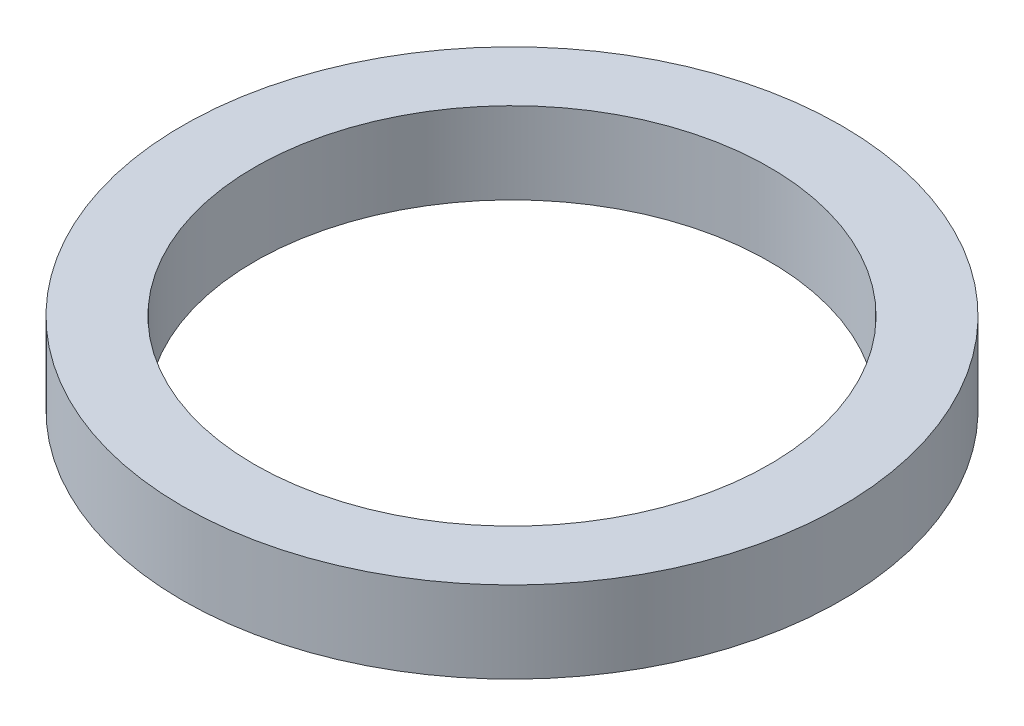
ISO-10303-21;
HEADER;
FILE_DESCRIPTION(('STEP AP214'),'2;1');
FILE_NAME('part.step','',(''),(''),'','','');
FILE_SCHEMA(('AUTOMOTIVE_DESIGN { 1 0 10303 214 1 1 1 1 }'));
ENDSEC;
DATA;
#1=APPLICATION_CONTEXT('core data for automotive mechanical design processes');
#2=APPLICATION_PROTOCOL_DEFINITION('international standard','automotive_design',2000,#1);
#3=PRODUCT_CONTEXT('',#1,'mechanical');
#4=PRODUCT('Part','Part','',(#3));
#5=PRODUCT_RELATED_PRODUCT_CATEGORY('part','',(#4));
#6=PRODUCT_DEFINITION_FORMATION('','',#4);
#7=PRODUCT_DEFINITION_CONTEXT('part definition',#1,'design');
#8=PRODUCT_DEFINITION('design','',#6,#7);
#9=PRODUCT_DEFINITION_SHAPE('','',#8);
#10=(LENGTH_UNIT() NAMED_UNIT(*) SI_UNIT(.MILLI.,.METRE.));
#11=(NAMED_UNIT(*) PLANE_ANGLE_UNIT() SI_UNIT($,.RADIAN.));
#12=(NAMED_UNIT(*) SI_UNIT($,.STERADIAN.) SOLID_ANGLE_UNIT());
#13=UNCERTAINTY_MEASURE_WITH_UNIT(LENGTH_MEASURE(1.E-05),#10,'distance_accuracy_value','');
#14=(GEOMETRIC_REPRESENTATION_CONTEXT(3) GLOBAL_UNCERTAINTY_ASSIGNED_CONTEXT((#13)) GLOBAL_UNIT_ASSIGNED_CONTEXT((#10,
#11,#12)) REPRESENTATION_CONTEXT('',''));
#15=CARTESIAN_POINT('',(0.,0.,0.));
#16=DIRECTION('',(0.,0.,1.));
#17=DIRECTION('',(1.,0.,0.));
#18=AXIS2_PLACEMENT_3D('',#15,#16,#17);
#19=CARTESIAN_POINT('',(0.,3.96,0.));
#20=DIRECTION('',(0.,1.,0.));
#21=DIRECTION('',(0.,0.,1.));
#22=AXIS2_PLACEMENT_3D('',#19,#20,#21);
#23=PLANE('',#22);
#24=CARTESIAN_POINT('',(0.,3.96,0.));
#25=DIRECTION('',(0.,1.,0.));
#26=DIRECTION('',(0.,0.,1.));
#27=AXIS2_PLACEMENT_3D('',#24,#25,#26);
#28=CIRCLE('',#27,16.);
#29=CARTESIAN_POINT('',(0.,3.96,16.));
#30=VERTEX_POINT('',#29);
#31=EDGE_CURVE('E10',#30,#30,#28,.T.);
#32=ORIENTED_EDGE('',*,*,#31,.T.);
#33=EDGE_LOOP('',(#32));
#34=FACE_BOUND('',#33,.T.);
#35=CARTESIAN_POINT('',(0.,3.96,0.));
#36=DIRECTION('',(0.,1.,0.));
#37=DIRECTION('',(0.,0.,1.));
#38=AXIS2_PLACEMENT_3D('',#35,#36,#37);
#39=CIRCLE('',#38,12.5);
#40=CARTESIAN_POINT('',(0.,3.96,12.5));
#41=VERTEX_POINT('',#40);
#42=EDGE_CURVE('E56',#41,#41,#39,.T.);
#43=ORIENTED_EDGE('',*,*,#42,.F.);
#44=EDGE_LOOP('',(#43));
#45=FACE_BOUND('',#44,.T.);
#46=ADVANCED_FACE('F43',(#34,#45),#23,.T.);
#47=CARTESIAN_POINT('',(0.,0.,0.));
#48=DIRECTION('',(0.,1.,0.));
#49=DIRECTION('',(0.,0.,1.));
#50=AXIS2_PLACEMENT_3D('',#47,#48,#49);
#51=PLANE('',#50);
#52=CARTESIAN_POINT('',(0.,0.,0.));
#53=DIRECTION('',(0.,1.,0.));
#54=DIRECTION('',(0.,0.,1.));
#55=AXIS2_PLACEMENT_3D('',#52,#53,#54);
#56=CIRCLE('',#55,16.);
#57=CARTESIAN_POINT('',(0.,0.,16.));
#58=VERTEX_POINT('',#57);
#59=EDGE_CURVE('E47',#58,#58,#56,.T.);
#60=ORIENTED_EDGE('',*,*,#59,.F.);
#61=EDGE_LOOP('',(#60));
#62=FACE_BOUND('',#61,.T.);
#63=CARTESIAN_POINT('',(0.,0.,0.));
#64=DIRECTION('',(0.,1.,0.));
#65=DIRECTION('',(0.,0.,1.));
#66=AXIS2_PLACEMENT_3D('',#63,#64,#65);
#67=CIRCLE('',#66,12.5);
#68=CARTESIAN_POINT('',(0.,0.,12.5));
#69=VERTEX_POINT('',#68);
#70=EDGE_CURVE('E58',#69,#69,#67,.T.);
#71=ORIENTED_EDGE('',*,*,#70,.T.);
#72=EDGE_LOOP('',(#71));
#73=FACE_BOUND('',#72,.T.);
#74=ADVANCED_FACE('F70',(#62,#73),#51,.F.);
#75=CARTESIAN_POINT('',(0.,3.96,0.));
#76=DIRECTION('',(0.,-1.,0.));
#77=DIRECTION('',(0.,0.,-1.));
#78=AXIS2_PLACEMENT_3D('',#75,#76,#77);
#79=CYLINDRICAL_SURFACE('',#78,16.);
#80=ORIENTED_EDGE('',*,*,#31,.F.);
#81=EDGE_LOOP('',(#80));
#82=FACE_BOUND('',#81,.T.);
#83=ORIENTED_EDGE('',*,*,#59,.T.);
#84=EDGE_LOOP('',(#83));
#85=FACE_BOUND('',#84,.T.);
#86=ADVANCED_FACE('F45',(#82,#85),#79,.T.);
#87=CARTESIAN_POINT('',(0.,3.96,0.));
#88=DIRECTION('',(0.,-1.,0.));
#89=DIRECTION('',(0.,0.,-1.));
#90=AXIS2_PLACEMENT_3D('',#87,#88,#89);
#91=CYLINDRICAL_SURFACE('',#90,12.5);
#92=ORIENTED_EDGE('',*,*,#42,.T.);
#93=EDGE_LOOP('',(#92));
#94=FACE_BOUND('',#93,.T.);
#95=ORIENTED_EDGE('',*,*,#70,.F.);
#96=EDGE_LOOP('',(#95));
#97=FACE_BOUND('',#96,.T.);
#98=ADVANCED_FACE('F66',(#94,#97),#91,.F.);
#99=CLOSED_SHELL('',(#46,#74,#86,#98));
#100=MANIFOLD_SOLID_BREP('B2',#99);
#101=ADVANCED_BREP_SHAPE_REPRESENTATION('',(#18,#100),#14);
#102=SHAPE_DEFINITION_REPRESENTATION(#9,#101);
ENDSEC;
END-ISO-10303-21;
